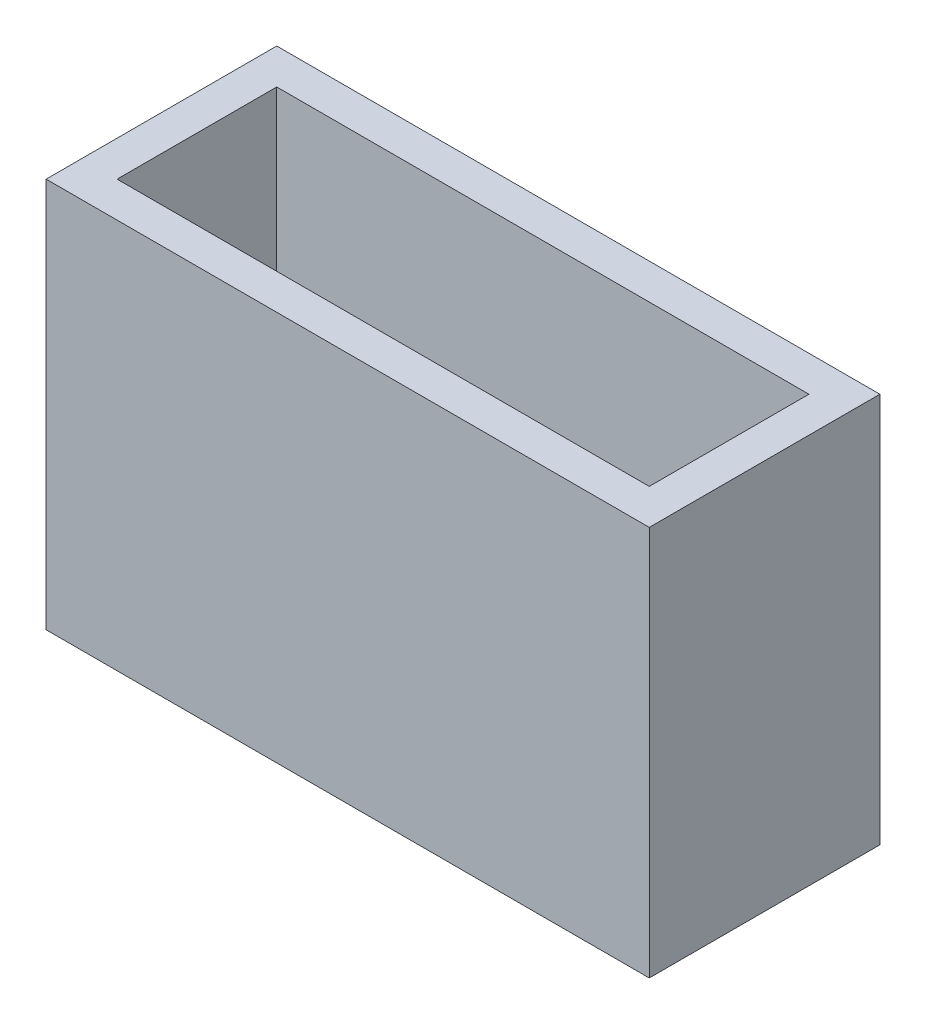
ISO-10303-21;
HEADER;
FILE_DESCRIPTION(('STEP AP214'),'2;1');
FILE_NAME('part.step','',(''),(''),'','','');
FILE_SCHEMA(('AUTOMOTIVE_DESIGN { 1 0 10303 214 1 1 1 1 }'));
ENDSEC;
DATA;
#1=APPLICATION_CONTEXT('core data for automotive mechanical design processes');
#2=APPLICATION_PROTOCOL_DEFINITION('international standard','automotive_design',2000,#1);
#3=PRODUCT_CONTEXT('',#1,'mechanical');
#4=PRODUCT('Part','Part','',(#3));
#5=PRODUCT_RELATED_PRODUCT_CATEGORY('part','',(#4));
#6=PRODUCT_DEFINITION_FORMATION('','',#4);
#7=PRODUCT_DEFINITION_CONTEXT('part definition',#1,'design');
#8=PRODUCT_DEFINITION('design','',#6,#7);
#9=PRODUCT_DEFINITION_SHAPE('','',#8);
#10=(LENGTH_UNIT() NAMED_UNIT(*) SI_UNIT(.MILLI.,.METRE.));
#11=(NAMED_UNIT(*) PLANE_ANGLE_UNIT() SI_UNIT($,.RADIAN.));
#12=(NAMED_UNIT(*) SI_UNIT($,.STERADIAN.) SOLID_ANGLE_UNIT());
#13=UNCERTAINTY_MEASURE_WITH_UNIT(LENGTH_MEASURE(1.E-05),#10,'distance_accuracy_value','');
#14=(GEOMETRIC_REPRESENTATION_CONTEXT(3) GLOBAL_UNCERTAINTY_ASSIGNED_CONTEXT((#13)) GLOBAL_UNIT_ASSIGNED_CONTEXT((#10,
#11,#12)) REPRESENTATION_CONTEXT('',''));
#15=CARTESIAN_POINT('',(0.,0.,0.));
#16=DIRECTION('',(0.,0.,1.));
#17=DIRECTION('',(1.,0.,0.));
#18=AXIS2_PLACEMENT_3D('',#15,#16,#17);
#19=CARTESIAN_POINT('',(0.,220.,0.));
#20=DIRECTION('',(0.,-1.,0.));
#21=DIRECTION('',(0.,0.,-1.));
#22=AXIS2_PLACEMENT_3D('',#19,#20,#21);
#23=PLANE('',#22);
#24=DIRECTION('',(0.,0.,-1.));
#25=VECTOR('',#24,1.);
#26=CARTESIAN_POINT('',(170.,220.,65.));
#27=LINE('',#26,#25);
#28=CARTESIAN_POINT('',(170.,220.,65.));
#29=VERTEX_POINT('',#28);
#30=CARTESIAN_POINT('',(170.,220.,-65.));
#31=VERTEX_POINT('',#30);
#32=EDGE_CURVE('E158',#29,#31,#27,.T.);
#33=ORIENTED_EDGE('',*,*,#32,.T.);
#34=DIRECTION('',(-1.,0.,0.));
#35=VECTOR('',#34,1.);
#36=CARTESIAN_POINT('',(-170.,220.,-65.));
#37=LINE('',#36,#35);
#38=CARTESIAN_POINT('',(-170.,220.,-65.));
#39=VERTEX_POINT('',#38);
#40=EDGE_CURVE('E162',#31,#39,#37,.T.);
#41=ORIENTED_EDGE('',*,*,#40,.T.);
#42=DIRECTION('',(0.,0.,1.));
#43=VECTOR('',#42,1.);
#44=CARTESIAN_POINT('',(-170.,220.,65.));
#45=LINE('',#44,#43);
#46=CARTESIAN_POINT('',(-170.,220.,65.));
#47=VERTEX_POINT('',#46);
#48=EDGE_CURVE('E166',#39,#47,#45,.T.);
#49=ORIENTED_EDGE('',*,*,#48,.T.);
#50=DIRECTION('',(1.,0.,0.));
#51=VECTOR('',#50,1.);
#52=CARTESIAN_POINT('',(-170.,220.,65.));
#53=LINE('',#52,#51);
#54=EDGE_CURVE('E169',#47,#29,#53,.T.);
#55=ORIENTED_EDGE('',*,*,#54,.T.);
#56=EDGE_LOOP('',(#33,#41,#49,#55));
#57=FACE_BOUND('',#56,.T.);
#58=DIRECTION('',(0.,0.,1.));
#59=VECTOR('',#58,1.);
#60=CARTESIAN_POINT('',(-150.,220.,45.));
#61=LINE('',#60,#59);
#62=CARTESIAN_POINT('',(-150.,220.,-45.));
#63=VERTEX_POINT('',#62);
#64=CARTESIAN_POINT('',(-150.,220.,45.));
#65=VERTEX_POINT('',#64);
#66=EDGE_CURVE('E131',#63,#65,#61,.T.);
#67=ORIENTED_EDGE('',*,*,#66,.F.);
#68=DIRECTION('',(-1.,0.,0.));
#69=VECTOR('',#68,1.);
#70=CARTESIAN_POINT('',(-150.,220.,-45.));
#71=LINE('',#70,#69);
#72=CARTESIAN_POINT('',(150.,220.,-45.));
#73=VERTEX_POINT('',#72);
#74=EDGE_CURVE('E119',#73,#63,#71,.T.);
#75=ORIENTED_EDGE('',*,*,#74,.F.);
#76=DIRECTION('',(0.,0.,-1.));
#77=VECTOR('',#76,1.);
#78=CARTESIAN_POINT('',(150.,220.,45.));
#79=LINE('',#78,#77);
#80=CARTESIAN_POINT('',(150.,220.,45.));
#81=VERTEX_POINT('',#80);
#82=EDGE_CURVE('E144',#81,#73,#79,.T.);
#83=ORIENTED_EDGE('',*,*,#82,.F.);
#84=DIRECTION('',(1.,0.,0.));
#85=VECTOR('',#84,1.);
#86=CARTESIAN_POINT('',(-150.,220.,45.));
#87=LINE('',#86,#85);
#88=EDGE_CURVE('E141',#65,#81,#87,.T.);
#89=ORIENTED_EDGE('',*,*,#88,.F.);
#90=EDGE_LOOP('',(#67,#75,#83,#89));
#91=FACE_BOUND('',#90,.T.);
#92=ADVANCED_FACE('F47',(#57,#91),#23,.F.);
#93=CARTESIAN_POINT('',(0.,0.,0.));
#94=DIRECTION('',(0.,-1.,0.));
#95=DIRECTION('',(0.,0.,-1.));
#96=AXIS2_PLACEMENT_3D('',#93,#94,#95);
#97=PLANE('',#96);
#98=DIRECTION('',(0.,0.,-1.));
#99=VECTOR('',#98,1.);
#100=CARTESIAN_POINT('',(170.,0.,65.));
#101=LINE('',#100,#99);
#102=CARTESIAN_POINT('',(170.,0.,65.));
#103=VERTEX_POINT('',#102);
#104=CARTESIAN_POINT('',(170.,0.,-65.));
#105=VERTEX_POINT('',#104);
#106=EDGE_CURVE('E157',#103,#105,#101,.T.);
#107=ORIENTED_EDGE('',*,*,#106,.F.);
#108=DIRECTION('',(1.,0.,0.));
#109=VECTOR('',#108,1.);
#110=CARTESIAN_POINT('',(-170.,0.,65.));
#111=LINE('',#110,#109);
#112=CARTESIAN_POINT('',(-170.,0.,65.));
#113=VERTEX_POINT('',#112);
#114=EDGE_CURVE('E163',#113,#103,#111,.T.);
#115=ORIENTED_EDGE('',*,*,#114,.F.);
#116=DIRECTION('',(0.,0.,1.));
#117=VECTOR('',#116,1.);
#118=CARTESIAN_POINT('',(-170.,0.,65.));
#119=LINE('',#118,#117);
#120=CARTESIAN_POINT('',(-170.,0.,-65.));
#121=VERTEX_POINT('',#120);
#122=EDGE_CURVE('E180',#121,#113,#119,.T.);
#123=ORIENTED_EDGE('',*,*,#122,.F.);
#124=DIRECTION('',(-1.,0.,0.));
#125=VECTOR('',#124,1.);
#126=CARTESIAN_POINT('',(-170.,0.,-65.));
#127=LINE('',#126,#125);
#128=EDGE_CURVE('E176',#105,#121,#127,.T.);
#129=ORIENTED_EDGE('',*,*,#128,.F.);
#130=EDGE_LOOP('',(#107,#115,#123,#129));
#131=FACE_BOUND('',#130,.T.);
#132=ADVANCED_FACE('F205',(#131),#97,.T.);
#133=CARTESIAN_POINT('',(170.,220.,65.));
#134=DIRECTION('',(-1.,0.,0.));
#135=DIRECTION('',(0.,0.,1.));
#136=AXIS2_PLACEMENT_3D('',#133,#134,#135);
#137=PLANE('',#136);
#138=DIRECTION('',(0.,-1.,0.));
#139=VECTOR('',#138,1.);
#140=CARTESIAN_POINT('',(170.,220.,65.));
#141=LINE('',#140,#139);
#142=EDGE_CURVE('E172',#29,#103,#141,.T.);
#143=ORIENTED_EDGE('',*,*,#142,.T.);
#144=ORIENTED_EDGE('',*,*,#106,.T.);
#145=DIRECTION('',(0.,-1.,0.));
#146=VECTOR('',#145,1.);
#147=CARTESIAN_POINT('',(170.,220.,-65.));
#148=LINE('',#147,#146);
#149=EDGE_CURVE('E56',#31,#105,#148,.T.);
#150=ORIENTED_EDGE('',*,*,#149,.F.);
#151=ORIENTED_EDGE('',*,*,#32,.F.);
#152=EDGE_LOOP('',(#143,#144,#150,#151));
#153=FACE_BOUND('',#152,.T.);
#154=ADVANCED_FACE('F49',(#153),#137,.F.);
#155=CARTESIAN_POINT('',(-170.,220.,-65.));
#156=DIRECTION('',(0.,0.,1.));
#157=DIRECTION('',(1.,0.,0.));
#158=AXIS2_PLACEMENT_3D('',#155,#156,#157);
#159=PLANE('',#158);
#160=ORIENTED_EDGE('',*,*,#149,.T.);
#161=ORIENTED_EDGE('',*,*,#128,.T.);
#162=DIRECTION('',(0.,-1.,0.));
#163=VECTOR('',#162,1.);
#164=CARTESIAN_POINT('',(-170.,220.,-65.));
#165=LINE('',#164,#163);
#166=EDGE_CURVE('E192',#39,#121,#165,.T.);
#167=ORIENTED_EDGE('',*,*,#166,.F.);
#168=ORIENTED_EDGE('',*,*,#40,.F.);
#169=EDGE_LOOP('',(#160,#161,#167,#168));
#170=FACE_BOUND('',#169,.T.);
#171=ADVANCED_FACE('F198',(#170),#159,.F.);
#172=CARTESIAN_POINT('',(-170.,220.,65.));
#173=DIRECTION('',(1.,0.,0.));
#174=DIRECTION('',(0.,0.,-1.));
#175=AXIS2_PLACEMENT_3D('',#172,#173,#174);
#176=PLANE('',#175);
#177=ORIENTED_EDGE('',*,*,#166,.T.);
#178=ORIENTED_EDGE('',*,*,#122,.T.);
#179=DIRECTION('',(0.,-1.,0.));
#180=VECTOR('',#179,1.);
#181=CARTESIAN_POINT('',(-170.,220.,65.));
#182=LINE('',#181,#180);
#183=EDGE_CURVE('E189',#47,#113,#182,.T.);
#184=ORIENTED_EDGE('',*,*,#183,.F.);
#185=ORIENTED_EDGE('',*,*,#48,.F.);
#186=EDGE_LOOP('',(#177,#178,#184,#185));
#187=FACE_BOUND('',#186,.T.);
#188=ADVANCED_FACE('F214',(#187),#176,.F.);
#189=CARTESIAN_POINT('',(-170.,220.,65.));
#190=DIRECTION('',(0.,0.,-1.));
#191=DIRECTION('',(-1.,0.,0.));
#192=AXIS2_PLACEMENT_3D('',#189,#190,#191);
#193=PLANE('',#192);
#194=ORIENTED_EDGE('',*,*,#183,.T.);
#195=ORIENTED_EDGE('',*,*,#114,.T.);
#196=ORIENTED_EDGE('',*,*,#142,.F.);
#197=ORIENTED_EDGE('',*,*,#54,.F.);
#198=EDGE_LOOP('',(#194,#195,#196,#197));
#199=FACE_BOUND('',#198,.T.);
#200=ADVANCED_FACE('F210',(#199),#193,.F.);
#201=CARTESIAN_POINT('',(-150.,220.,45.));
#202=DIRECTION('',(1.,0.,0.));
#203=DIRECTION('',(0.,0.,-1.));
#204=AXIS2_PLACEMENT_3D('',#201,#202,#203);
#205=PLANE('',#204);
#206=DIRECTION('',(0.,0.,1.));
#207=VECTOR('',#206,1.);
#208=CARTESIAN_POINT('',(-150.,11.6690145525353,45.));
#209=LINE('',#208,#207);
#210=CARTESIAN_POINT('',(-150.,11.6690145525353,-45.));
#211=VERTEX_POINT('',#210);
#212=CARTESIAN_POINT('',(-150.,11.6690145525353,45.));
#213=VERTEX_POINT('',#212);
#214=EDGE_CURVE('E126',#211,#213,#209,.T.);
#215=ORIENTED_EDGE('',*,*,#214,.F.);
#216=DIRECTION('',(0.,-1.,0.));
#217=VECTOR('',#216,1.);
#218=CARTESIAN_POINT('',(-150.,220.,-45.));
#219=LINE('',#218,#217);
#220=EDGE_CURVE('E115',#63,#211,#219,.T.);
#221=ORIENTED_EDGE('',*,*,#220,.F.);
#222=ORIENTED_EDGE('',*,*,#66,.T.);
#223=DIRECTION('',(0.,-1.,0.));
#224=VECTOR('',#223,1.);
#225=CARTESIAN_POINT('',(-150.,220.,45.));
#226=LINE('',#225,#224);
#227=EDGE_CURVE('E128',#65,#213,#226,.T.);
#228=ORIENTED_EDGE('',*,*,#227,.T.);
#229=EDGE_LOOP('',(#215,#221,#222,#228));
#230=FACE_BOUND('',#229,.T.);
#231=ADVANCED_FACE('F127',(#230),#205,.T.);
#232=CARTESIAN_POINT('',(-150.,220.,45.));
#233=DIRECTION('',(0.,0.,-1.));
#234=DIRECTION('',(-1.,0.,0.));
#235=AXIS2_PLACEMENT_3D('',#232,#233,#234);
#236=PLANE('',#235);
#237=DIRECTION('',(1.,0.,0.));
#238=VECTOR('',#237,1.);
#239=CARTESIAN_POINT('',(-150.,11.6690145525353,45.));
#240=LINE('',#239,#238);
#241=CARTESIAN_POINT('',(150.,11.6690145525353,45.));
#242=VERTEX_POINT('',#241);
#243=EDGE_CURVE('E63',#213,#242,#240,.T.);
#244=ORIENTED_EDGE('',*,*,#243,.F.);
#245=ORIENTED_EDGE('',*,*,#227,.F.);
#246=ORIENTED_EDGE('',*,*,#88,.T.);
#247=DIRECTION('',(0.,-1.,0.));
#248=VECTOR('',#247,1.);
#249=CARTESIAN_POINT('',(150.,220.,45.));
#250=LINE('',#249,#248);
#251=EDGE_CURVE('E152',#81,#242,#250,.T.);
#252=ORIENTED_EDGE('',*,*,#251,.T.);
#253=EDGE_LOOP('',(#244,#245,#246,#252));
#254=FACE_BOUND('',#253,.T.);
#255=ADVANCED_FACE('F221',(#254),#236,.T.);
#256=CARTESIAN_POINT('',(150.,220.,45.));
#257=DIRECTION('',(-1.,0.,0.));
#258=DIRECTION('',(0.,0.,1.));
#259=AXIS2_PLACEMENT_3D('',#256,#257,#258);
#260=PLANE('',#259);
#261=DIRECTION('',(0.,0.,-1.));
#262=VECTOR('',#261,1.);
#263=CARTESIAN_POINT('',(150.,11.6690145525353,45.));
#264=LINE('',#263,#262);
#265=CARTESIAN_POINT('',(150.,11.6690145525353,-45.));
#266=VERTEX_POINT('',#265);
#267=EDGE_CURVE('E71',#242,#266,#264,.T.);
#268=ORIENTED_EDGE('',*,*,#267,.F.);
#269=ORIENTED_EDGE('',*,*,#251,.F.);
#270=ORIENTED_EDGE('',*,*,#82,.T.);
#271=DIRECTION('',(0.,-1.,0.));
#272=VECTOR('',#271,1.);
#273=CARTESIAN_POINT('',(150.,220.,-45.));
#274=LINE('',#273,#272);
#275=EDGE_CURVE('E123',#73,#266,#274,.T.);
#276=ORIENTED_EDGE('',*,*,#275,.T.);
#277=EDGE_LOOP('',(#268,#269,#270,#276));
#278=FACE_BOUND('',#277,.T.);
#279=ADVANCED_FACE('F222',(#278),#260,.T.);
#280=CARTESIAN_POINT('',(-150.,220.,-45.));
#281=DIRECTION('',(0.,0.,1.));
#282=DIRECTION('',(1.,0.,0.));
#283=AXIS2_PLACEMENT_3D('',#280,#281,#282);
#284=PLANE('',#283);
#285=DIRECTION('',(-1.,0.,0.));
#286=VECTOR('',#285,1.);
#287=CARTESIAN_POINT('',(-150.,11.6690145525353,-45.));
#288=LINE('',#287,#286);
#289=EDGE_CURVE('E11',#266,#211,#288,.T.);
#290=ORIENTED_EDGE('',*,*,#289,.F.);
#291=ORIENTED_EDGE('',*,*,#275,.F.);
#292=ORIENTED_EDGE('',*,*,#74,.T.);
#293=ORIENTED_EDGE('',*,*,#220,.T.);
#294=EDGE_LOOP('',(#290,#291,#292,#293));
#295=FACE_BOUND('',#294,.T.);
#296=ADVANCED_FACE('F117',(#295),#284,.T.);
#297=CARTESIAN_POINT('',(170.,11.6690145525353,-65.));
#298=DIRECTION('',(0.,1.,0.));
#299=DIRECTION('',(0.,0.,1.));
#300=AXIS2_PLACEMENT_3D('',#297,#298,#299);
#301=PLANE('',#300);
#302=ORIENTED_EDGE('',*,*,#289,.T.);
#303=ORIENTED_EDGE('',*,*,#214,.T.);
#304=ORIENTED_EDGE('',*,*,#243,.T.);
#305=ORIENTED_EDGE('',*,*,#267,.T.);
#306=EDGE_LOOP('',(#302,#303,#304,#305));
#307=FACE_BOUND('',#306,.T.);
#308=ADVANCED_FACE('F133',(#307),#301,.T.);
#309=CLOSED_SHELL('',(#92,#132,#154,#171,#188,#200,#231,#255,#279,#296,#308));
#310=MANIFOLD_SOLID_BREP('B2',#309);
#311=ADVANCED_BREP_SHAPE_REPRESENTATION('',(#18,#310),#14);
#312=SHAPE_DEFINITION_REPRESENTATION(#9,#311);
ENDSEC;
END-ISO-10303-21;
